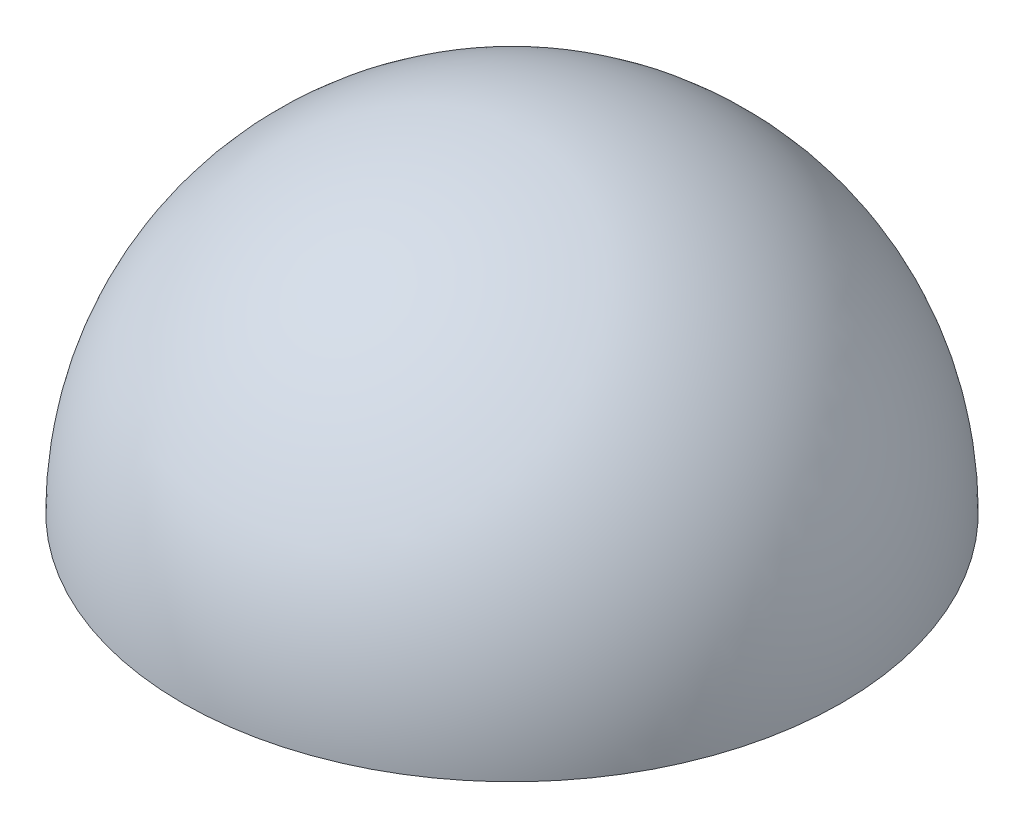
ISO-10303-21;
HEADER;
FILE_DESCRIPTION(('STEP AP214'),'2;1');
FILE_NAME('part.step','',(''),(''),'','','');
FILE_SCHEMA(('AUTOMOTIVE_DESIGN { 1 0 10303 214 1 1 1 1 }'));
ENDSEC;
DATA;
#1=APPLICATION_CONTEXT('core data for automotive mechanical design processes');
#2=APPLICATION_PROTOCOL_DEFINITION('international standard','automotive_design',2000,#1);
#3=PRODUCT_CONTEXT('',#1,'mechanical');
#4=PRODUCT('Part','Part','',(#3));
#5=PRODUCT_RELATED_PRODUCT_CATEGORY('part','',(#4));
#6=PRODUCT_DEFINITION_FORMATION('','',#4);
#7=PRODUCT_DEFINITION_CONTEXT('part definition',#1,'design');
#8=PRODUCT_DEFINITION('design','',#6,#7);
#9=PRODUCT_DEFINITION_SHAPE('','',#8);
#10=(LENGTH_UNIT() NAMED_UNIT(*) SI_UNIT(.MILLI.,.METRE.));
#11=(NAMED_UNIT(*) PLANE_ANGLE_UNIT() SI_UNIT($,.RADIAN.));
#12=(NAMED_UNIT(*) SI_UNIT($,.STERADIAN.) SOLID_ANGLE_UNIT());
#13=UNCERTAINTY_MEASURE_WITH_UNIT(LENGTH_MEASURE(1.E-05),#10,'distance_accuracy_value','');
#14=(GEOMETRIC_REPRESENTATION_CONTEXT(3) GLOBAL_UNCERTAINTY_ASSIGNED_CONTEXT((#13)) GLOBAL_UNIT_ASSIGNED_CONTEXT((#10,
#11,#12)) REPRESENTATION_CONTEXT('',''));
#15=CARTESIAN_POINT('',(0.,0.,0.));
#16=DIRECTION('',(0.,0.,1.));
#17=DIRECTION('',(1.,0.,0.));
#18=AXIS2_PLACEMENT_3D('',#15,#16,#17);
#19=CARTESIAN_POINT('',(12.5,0.,0.));
#20=DIRECTION('',(0.,-1.,0.));
#21=DIRECTION('',(0.,0.,-1.));
#22=AXIS2_PLACEMENT_3D('',#19,#20,#21);
#23=PLANE('',#22);
#24=CARTESIAN_POINT('',(0.,0.,0.));
#25=DIRECTION('',(0.,-1.,0.));
#26=DIRECTION('',(0.,0.,-1.));
#27=AXIS2_PLACEMENT_3D('',#24,#25,#26);
#28=CIRCLE('',#27,12.5);
#29=CARTESIAN_POINT('',(0.,0.,-12.5));
#30=VERTEX_POINT('',#29);
#31=EDGE_CURVE('E11',#30,#30,#28,.T.);
#32=ORIENTED_EDGE('',*,*,#31,.T.);
#33=EDGE_LOOP('',(#32));
#34=FACE_BOUND('',#33,.T.);
#35=DIRECTION('',(-0.422618261740697,0.,-0.906307787036651));
#36=VECTOR('',#35,1.);
#37=CARTESIAN_POINT('',(0.,0.,-9.));
#38=LINE('',#37,#36);
#39=CARTESIAN_POINT('',(2.55617271844715,0.,-3.51826991527231));
#40=VERTEX_POINT('',#39);
#41=CARTESIAN_POINT('',(0.,0.,-9.));
#42=VERTEX_POINT('',#41);
#43=EDGE_CURVE('E188',#40,#42,#38,.T.);
#44=ORIENTED_EDGE('',*,*,#43,.T.);
#45=DIRECTION('',(-0.422618261740697,0.,0.906307787036651));
#46=VECTOR('',#45,1.);
#47=CARTESIAN_POINT('',(-2.55617271844715,0.,-3.51826991527231));
#48=LINE('',#47,#46);
#49=CARTESIAN_POINT('',(-2.55617271844715,0.,-3.51826991527231));
#50=VERTEX_POINT('',#49);
#51=EDGE_CURVE('E58',#42,#50,#48,.T.);
#52=ORIENTED_EDGE('',*,*,#51,.T.);
#53=DIRECTION('',(-0.992546151641322,0.,0.121869343405145));
#54=VECTOR('',#53,1.);
#55=CARTESIAN_POINT('',(-8.55950864665638,0.,-2.78115294937452));
#56=LINE('',#55,#54);
#57=CARTESIAN_POINT('',(-8.55950864665638,0.,-2.78115294937452));
#58=VERTEX_POINT('',#57);
#59=EDGE_CURVE('E159',#50,#58,#56,.T.);
#60=ORIENTED_EDGE('',*,*,#59,.T.);
#61=DIRECTION('',(0.731353701619173,0.,0.681998360062496));
#62=VECTOR('',#61,1.);
#63=CARTESIAN_POINT('',(-4.13597433956271,0.,1.34385952603781));
#64=LINE('',#63,#62);
#65=CARTESIAN_POINT('',(-4.13597433956271,0.,1.34385952603781));
#66=VERTEX_POINT('',#65);
#67=EDGE_CURVE('E163',#58,#66,#64,.T.);
#68=ORIENTED_EDGE('',*,*,#67,.T.);
#69=DIRECTION('',(-0.190808995376547,0.,0.981627183447664));
#70=VECTOR('',#69,1.);
#71=CARTESIAN_POINT('',(-5.29006727063225,0.,7.28115294937453));
#72=LINE('',#71,#70);
#73=CARTESIAN_POINT('',(-5.29006727063225,0.,7.28115294937453));
#74=VERTEX_POINT('',#73);
#75=EDGE_CURVE('E167',#66,#74,#72,.T.);
#76=ORIENTED_EDGE('',*,*,#75,.T.);
#77=DIRECTION('',(0.874619707139394,0.,-0.48480962024634));
#78=VECTOR('',#77,1.);
#79=CARTESIAN_POINT('',(0.,0.,4.348820778469));
#80=LINE('',#79,#78);
#81=CARTESIAN_POINT('',(0.,0.,4.348820778469));
#82=VERTEX_POINT('',#81);
#83=EDGE_CURVE('E171',#74,#82,#80,.T.);
#84=ORIENTED_EDGE('',*,*,#83,.T.);
#85=DIRECTION('',(0.874619707139394,0.,0.48480962024634));
#86=VECTOR('',#85,1.);
#87=CARTESIAN_POINT('',(5.29006727063226,0.,7.28115294937453));
#88=LINE('',#87,#86);
#89=CARTESIAN_POINT('',(5.29006727063226,0.,7.28115294937453));
#90=VERTEX_POINT('',#89);
#91=EDGE_CURVE('E175',#82,#90,#88,.T.);
#92=ORIENTED_EDGE('',*,*,#91,.T.);
#93=DIRECTION('',(-0.190808995376547,0.,-0.981627183447664));
#94=VECTOR('',#93,1.);
#95=CARTESIAN_POINT('',(4.13597433956271,0.,1.34385952603781));
#96=LINE('',#95,#94);
#97=CARTESIAN_POINT('',(4.13597433956271,0.,1.34385952603781));
#98=VERTEX_POINT('',#97);
#99=EDGE_CURVE('E179',#90,#98,#96,.T.);
#100=ORIENTED_EDGE('',*,*,#99,.T.);
#101=DIRECTION('',(0.731353701619172,0.,-0.681998360062497));
#102=VECTOR('',#101,1.);
#103=CARTESIAN_POINT('',(8.55950864665638,0.,-2.78115294937453));
#104=LINE('',#103,#102);
#105=CARTESIAN_POINT('',(8.55950864665638,0.,-2.78115294937453));
#106=VERTEX_POINT('',#105);
#107=EDGE_CURVE('E183',#98,#106,#104,.T.);
#108=ORIENTED_EDGE('',*,*,#107,.T.);
#109=DIRECTION('',(-0.992546151641322,0.,-0.121869343405145));
#110=VECTOR('',#109,1.);
#111=CARTESIAN_POINT('',(2.55617271844715,0.,-3.51826991527231));
#112=LINE('',#111,#110);
#113=EDGE_CURVE('E145',#106,#40,#112,.T.);
#114=ORIENTED_EDGE('',*,*,#113,.T.);
#115=EDGE_LOOP('',(#44,#52,#60,#68,#76,#84,#92,#100,#108,#114));
#116=FACE_BOUND('',#115,.T.);
#117=ADVANCED_FACE('F42',(#34,#116),#23,.T.);
#118=CARTESIAN_POINT('',(0.,0.,0.));
#119=DIRECTION('',(0.,-1.,0.));
#120=DIRECTION('',(1.,0.,0.));
#121=AXIS2_PLACEMENT_3D('',#118,#119,#120);
#122=SPHERICAL_SURFACE('',#121,12.5);
#123=ORIENTED_EDGE('',*,*,#31,.F.);
#124=EDGE_LOOP('',(#123));
#125=FACE_BOUND('',#124,.T.);
#126=ADVANCED_FACE('F44',(#125),#122,.T.);
#127=CARTESIAN_POINT('',(-2.55617271844715,5.,-3.51826991527231));
#128=DIRECTION('',(0.906307787036651,0.,0.422618261740697));
#129=DIRECTION('',(0.422618261740697,0.,-0.906307787036651));
#130=AXIS2_PLACEMENT_3D('',#127,#128,#129);
#131=PLANE('',#130);
#132=ORIENTED_EDGE('',*,*,#51,.F.);
#133=DIRECTION('',(0.,-1.,0.));
#134=VECTOR('',#133,1.);
#135=CARTESIAN_POINT('',(0.,5.,-9.));
#136=LINE('',#135,#134);
#137=CARTESIAN_POINT('',(0.,5.,-9.));
#138=VERTEX_POINT('',#137);
#139=EDGE_CURVE('E153',#138,#42,#136,.T.);
#140=ORIENTED_EDGE('',*,*,#139,.F.);
#141=DIRECTION('',(-0.422618261740697,0.,0.906307787036651));
#142=VECTOR('',#141,1.);
#143=CARTESIAN_POINT('',(-2.55617271844715,5.,-3.51826991527231));
#144=LINE('',#143,#142);
#145=CARTESIAN_POINT('',(-2.55617271844715,5.,-3.51826991527231));
#146=VERTEX_POINT('',#145);
#147=EDGE_CURVE('E192',#138,#146,#144,.T.);
#148=ORIENTED_EDGE('',*,*,#147,.T.);
#149=DIRECTION('',(0.,-1.,0.));
#150=VECTOR('',#149,1.);
#151=CARTESIAN_POINT('',(-2.55617271844715,5.,-3.51826991527231));
#152=LINE('',#151,#150);
#153=EDGE_CURVE('E51',#146,#50,#152,.T.);
#154=ORIENTED_EDGE('',*,*,#153,.T.);
#155=EDGE_LOOP('',(#132,#140,#148,#154));
#156=FACE_BOUND('',#155,.T.);
#157=ADVANCED_FACE('F215',(#156),#131,.T.);
#158=CARTESIAN_POINT('',(-8.55950864665638,5.,-2.78115294937452));
#159=DIRECTION('',(0.121869343405145,0.,0.992546151641322));
#160=DIRECTION('',(0.992546151641322,0.,-0.121869343405145));
#161=AXIS2_PLACEMENT_3D('',#158,#159,#160);
#162=PLANE('',#161);
#163=ORIENTED_EDGE('',*,*,#59,.F.);
#164=ORIENTED_EDGE('',*,*,#153,.F.);
#165=DIRECTION('',(-0.992546151641322,0.,0.121869343405145));
#166=VECTOR('',#165,1.);
#167=CARTESIAN_POINT('',(-8.55950864665638,5.,-2.78115294937452));
#168=LINE('',#167,#166);
#169=CARTESIAN_POINT('',(-8.55950864665638,5.,-2.78115294937452));
#170=VERTEX_POINT('',#169);
#171=EDGE_CURVE('E109',#146,#170,#168,.T.);
#172=ORIENTED_EDGE('',*,*,#171,.T.);
#173=DIRECTION('',(0.,-1.,0.));
#174=VECTOR('',#173,1.);
#175=CARTESIAN_POINT('',(-8.55950864665638,5.,-2.78115294937452));
#176=LINE('',#175,#174);
#177=EDGE_CURVE('E211',#170,#58,#176,.T.);
#178=ORIENTED_EDGE('',*,*,#177,.T.);
#179=EDGE_LOOP('',(#163,#164,#172,#178));
#180=FACE_BOUND('',#179,.T.);
#181=ADVANCED_FACE('F259',(#180),#162,.T.);
#182=CARTESIAN_POINT('',(-4.13597433956271,5.,1.34385952603781));
#183=DIRECTION('',(0.681998360062496,0.,-0.731353701619173));
#184=DIRECTION('',(-0.731353701619173,0.,-0.681998360062496));
#185=AXIS2_PLACEMENT_3D('',#182,#183,#184);
#186=PLANE('',#185);
#187=ORIENTED_EDGE('',*,*,#67,.F.);
#188=ORIENTED_EDGE('',*,*,#177,.F.);
#189=DIRECTION('',(0.731353701619173,0.,0.681998360062496));
#190=VECTOR('',#189,1.);
#191=CARTESIAN_POINT('',(-4.13597433956271,5.,1.34385952603781));
#192=LINE('',#191,#190);
#193=CARTESIAN_POINT('',(-4.13597433956271,5.,1.34385952603781));
#194=VERTEX_POINT('',#193);
#195=EDGE_CURVE('E222',#170,#194,#192,.T.);
#196=ORIENTED_EDGE('',*,*,#195,.T.);
#197=DIRECTION('',(0.,-1.,0.));
#198=VECTOR('',#197,1.);
#199=CARTESIAN_POINT('',(-4.13597433956271,5.,1.34385952603781));
#200=LINE('',#199,#198);
#201=EDGE_CURVE('E208',#194,#66,#200,.T.);
#202=ORIENTED_EDGE('',*,*,#201,.T.);
#203=EDGE_LOOP('',(#187,#188,#196,#202));
#204=FACE_BOUND('',#203,.T.);
#205=ADVANCED_FACE('F258',(#204),#186,.T.);
#206=CARTESIAN_POINT('',(-5.29006727063225,5.,7.28115294937453));
#207=DIRECTION('',(0.981627183447664,0.,0.190808995376547));
#208=DIRECTION('',(0.190808995376547,0.,-0.981627183447664));
#209=AXIS2_PLACEMENT_3D('',#206,#207,#208);
#210=PLANE('',#209);
#211=ORIENTED_EDGE('',*,*,#75,.F.);
#212=ORIENTED_EDGE('',*,*,#201,.F.);
#213=DIRECTION('',(-0.190808995376547,0.,0.981627183447664));
#214=VECTOR('',#213,1.);
#215=CARTESIAN_POINT('',(-5.29006727063225,5.,7.28115294937453));
#216=LINE('',#215,#214);
#217=CARTESIAN_POINT('',(-5.29006727063225,5.,7.28115294937453));
#218=VERTEX_POINT('',#217);
#219=EDGE_CURVE('E227',#194,#218,#216,.T.);
#220=ORIENTED_EDGE('',*,*,#219,.T.);
#221=DIRECTION('',(0.,-1.,0.));
#222=VECTOR('',#221,1.);
#223=CARTESIAN_POINT('',(-5.29006727063225,5.,7.28115294937453));
#224=LINE('',#223,#222);
#225=EDGE_CURVE('E205',#218,#74,#224,.T.);
#226=ORIENTED_EDGE('',*,*,#225,.T.);
#227=EDGE_LOOP('',(#211,#212,#220,#226));
#228=FACE_BOUND('',#227,.T.);
#229=ADVANCED_FACE('F253',(#228),#210,.T.);
#230=CARTESIAN_POINT('',(0.,5.,4.348820778469));
#231=DIRECTION('',(-0.48480962024634,0.,-0.874619707139394));
#232=DIRECTION('',(-0.874619707139394,0.,0.48480962024634));
#233=AXIS2_PLACEMENT_3D('',#230,#231,#232);
#234=PLANE('',#233);
#235=ORIENTED_EDGE('',*,*,#83,.F.);
#236=ORIENTED_EDGE('',*,*,#225,.F.);
#237=DIRECTION('',(0.874619707139394,0.,-0.48480962024634));
#238=VECTOR('',#237,1.);
#239=CARTESIAN_POINT('',(0.,5.,4.348820778469));
#240=LINE('',#239,#238);
#241=CARTESIAN_POINT('',(0.,5.,4.348820778469));
#242=VERTEX_POINT('',#241);
#243=EDGE_CURVE('E230',#218,#242,#240,.T.);
#244=ORIENTED_EDGE('',*,*,#243,.T.);
#245=DIRECTION('',(0.,-1.,0.));
#246=VECTOR('',#245,1.);
#247=CARTESIAN_POINT('',(0.,5.,4.348820778469));
#248=LINE('',#247,#246);
#249=EDGE_CURVE('E202',#242,#82,#248,.T.);
#250=ORIENTED_EDGE('',*,*,#249,.T.);
#251=EDGE_LOOP('',(#235,#236,#244,#250));
#252=FACE_BOUND('',#251,.T.);
#253=ADVANCED_FACE('F249',(#252),#234,.T.);
#254=CARTESIAN_POINT('',(5.29006727063226,5.,7.28115294937453));
#255=DIRECTION('',(0.48480962024634,0.,-0.874619707139394));
#256=DIRECTION('',(-0.874619707139394,0.,-0.48480962024634));
#257=AXIS2_PLACEMENT_3D('',#254,#255,#256);
#258=PLANE('',#257);
#259=ORIENTED_EDGE('',*,*,#91,.F.);
#260=ORIENTED_EDGE('',*,*,#249,.F.);
#261=DIRECTION('',(0.874619707139394,0.,0.48480962024634));
#262=VECTOR('',#261,1.);
#263=CARTESIAN_POINT('',(5.29006727063226,5.,7.28115294937453));
#264=LINE('',#263,#262);
#265=CARTESIAN_POINT('',(5.29006727063226,5.,7.28115294937453));
#266=VERTEX_POINT('',#265);
#267=EDGE_CURVE('E233',#242,#266,#264,.T.);
#268=ORIENTED_EDGE('',*,*,#267,.T.);
#269=DIRECTION('',(0.,-1.,0.));
#270=VECTOR('',#269,1.);
#271=CARTESIAN_POINT('',(5.29006727063226,5.,7.28115294937453));
#272=LINE('',#271,#270);
#273=EDGE_CURVE('E199',#266,#90,#272,.T.);
#274=ORIENTED_EDGE('',*,*,#273,.T.);
#275=EDGE_LOOP('',(#259,#260,#268,#274));
#276=FACE_BOUND('',#275,.T.);
#277=ADVANCED_FACE('F246',(#276),#258,.T.);
#278=CARTESIAN_POINT('',(4.13597433956271,5.,1.34385952603781));
#279=DIRECTION('',(-0.981627183447664,0.,0.190808995376547));
#280=DIRECTION('',(0.190808995376547,0.,0.981627183447664));
#281=AXIS2_PLACEMENT_3D('',#278,#279,#280);
#282=PLANE('',#281);
#283=ORIENTED_EDGE('',*,*,#99,.F.);
#284=ORIENTED_EDGE('',*,*,#273,.F.);
#285=DIRECTION('',(-0.190808995376547,0.,-0.981627183447664));
#286=VECTOR('',#285,1.);
#287=CARTESIAN_POINT('',(4.13597433956271,5.,1.34385952603781));
#288=LINE('',#287,#286);
#289=CARTESIAN_POINT('',(4.13597433956271,5.,1.34385952603781));
#290=VERTEX_POINT('',#289);
#291=EDGE_CURVE('E141',#266,#290,#288,.T.);
#292=ORIENTED_EDGE('',*,*,#291,.T.);
#293=DIRECTION('',(0.,-1.,0.));
#294=VECTOR('',#293,1.);
#295=CARTESIAN_POINT('',(4.13597433956271,5.,1.34385952603781));
#296=LINE('',#295,#294);
#297=EDGE_CURVE('E136',#290,#98,#296,.T.);
#298=ORIENTED_EDGE('',*,*,#297,.T.);
#299=EDGE_LOOP('',(#283,#284,#292,#298));
#300=FACE_BOUND('',#299,.T.);
#301=ADVANCED_FACE('F239',(#300),#282,.T.);
#302=CARTESIAN_POINT('',(8.55950864665638,5.,-2.78115294937453));
#303=DIRECTION('',(-0.681998360062497,0.,-0.731353701619172));
#304=DIRECTION('',(-0.731353701619172,0.,0.681998360062497));
#305=AXIS2_PLACEMENT_3D('',#302,#303,#304);
#306=PLANE('',#305);
#307=ORIENTED_EDGE('',*,*,#107,.F.);
#308=ORIENTED_EDGE('',*,*,#297,.F.);
#309=DIRECTION('',(0.731353701619172,0.,-0.681998360062497));
#310=VECTOR('',#309,1.);
#311=CARTESIAN_POINT('',(8.55950864665638,5.,-2.78115294937453));
#312=LINE('',#311,#310);
#313=CARTESIAN_POINT('',(8.55950864665638,5.,-2.78115294937453));
#314=VERTEX_POINT('',#313);
#315=EDGE_CURVE('E131',#290,#314,#312,.T.);
#316=ORIENTED_EDGE('',*,*,#315,.T.);
#317=DIRECTION('',(0.,-1.,0.));
#318=VECTOR('',#317,1.);
#319=CARTESIAN_POINT('',(8.55950864665638,5.,-2.78115294937453));
#320=LINE('',#319,#318);
#321=EDGE_CURVE('E135',#314,#106,#320,.T.);
#322=ORIENTED_EDGE('',*,*,#321,.T.);
#323=EDGE_LOOP('',(#307,#308,#316,#322));
#324=FACE_BOUND('',#323,.T.);
#325=ADVANCED_FACE('F134',(#324),#306,.T.);
#326=CARTESIAN_POINT('',(2.55617271844715,5.,-3.51826991527231));
#327=DIRECTION('',(-0.121869343405145,0.,0.992546151641322));
#328=DIRECTION('',(0.992546151641322,0.,0.121869343405145));
#329=AXIS2_PLACEMENT_3D('',#326,#327,#328);
#330=PLANE('',#329);
#331=ORIENTED_EDGE('',*,*,#113,.F.);
#332=ORIENTED_EDGE('',*,*,#321,.F.);
#333=DIRECTION('',(-0.992546151641322,0.,-0.121869343405145));
#334=VECTOR('',#333,1.);
#335=CARTESIAN_POINT('',(2.55617271844715,5.,-3.51826991527231));
#336=LINE('',#335,#334);
#337=CARTESIAN_POINT('',(2.55617271844715,5.,-3.51826991527231));
#338=VERTEX_POINT('',#337);
#339=EDGE_CURVE('E140',#314,#338,#336,.T.);
#340=ORIENTED_EDGE('',*,*,#339,.T.);
#341=DIRECTION('',(0.,-1.,0.));
#342=VECTOR('',#341,1.);
#343=CARTESIAN_POINT('',(2.55617271844715,5.,-3.51826991527231));
#344=LINE('',#343,#342);
#345=EDGE_CURVE('E100',#338,#40,#344,.T.);
#346=ORIENTED_EDGE('',*,*,#345,.T.);
#347=EDGE_LOOP('',(#331,#332,#340,#346));
#348=FACE_BOUND('',#347,.T.);
#349=ADVANCED_FACE('F143',(#348),#330,.T.);
#350=CARTESIAN_POINT('',(0.,5.,-9.));
#351=DIRECTION('',(-0.906307787036651,0.,0.422618261740697));
#352=DIRECTION('',(0.422618261740697,0.,0.906307787036651));
#353=AXIS2_PLACEMENT_3D('',#350,#351,#352);
#354=PLANE('',#353);
#355=ORIENTED_EDGE('',*,*,#43,.F.);
#356=ORIENTED_EDGE('',*,*,#345,.F.);
#357=DIRECTION('',(-0.422618261740697,0.,-0.906307787036651));
#358=VECTOR('',#357,1.);
#359=CARTESIAN_POINT('',(0.,5.,-9.));
#360=LINE('',#359,#358);
#361=EDGE_CURVE('E66',#338,#138,#360,.T.);
#362=ORIENTED_EDGE('',*,*,#361,.T.);
#363=ORIENTED_EDGE('',*,*,#139,.T.);
#364=EDGE_LOOP('',(#355,#356,#362,#363));
#365=FACE_BOUND('',#364,.T.);
#366=ADVANCED_FACE('F218',(#365),#354,.T.);
#367=CARTESIAN_POINT('',(0.,5.,0.));
#368=DIRECTION('',(0.,1.,0.));
#369=DIRECTION('',(0.,0.,1.));
#370=AXIS2_PLACEMENT_3D('',#367,#368,#369);
#371=PLANE('',#370);
#372=ORIENTED_EDGE('',*,*,#147,.F.);
#373=ORIENTED_EDGE('',*,*,#361,.F.);
#374=ORIENTED_EDGE('',*,*,#339,.F.);
#375=ORIENTED_EDGE('',*,*,#315,.F.);
#376=ORIENTED_EDGE('',*,*,#291,.F.);
#377=ORIENTED_EDGE('',*,*,#267,.F.);
#378=ORIENTED_EDGE('',*,*,#243,.F.);
#379=ORIENTED_EDGE('',*,*,#219,.F.);
#380=ORIENTED_EDGE('',*,*,#195,.F.);
#381=ORIENTED_EDGE('',*,*,#171,.F.);
#382=EDGE_LOOP('',(#372,#373,#374,#375,#376,#377,#378,#379,#380,#381));
#383=FACE_BOUND('',#382,.T.);
#384=ADVANCED_FACE('F149',(#383),#371,.F.);
#385=CLOSED_SHELL('',(#117,#126,#157,#181,#205,#229,#253,#277,#301,#325,#349,#366,#384));
#386=MANIFOLD_SOLID_BREP('B2',#385);
#387=ADVANCED_BREP_SHAPE_REPRESENTATION('',(#18,#386),#14);
#388=SHAPE_DEFINITION_REPRESENTATION(#9,#387);
ENDSEC;
END-ISO-10303-21;
